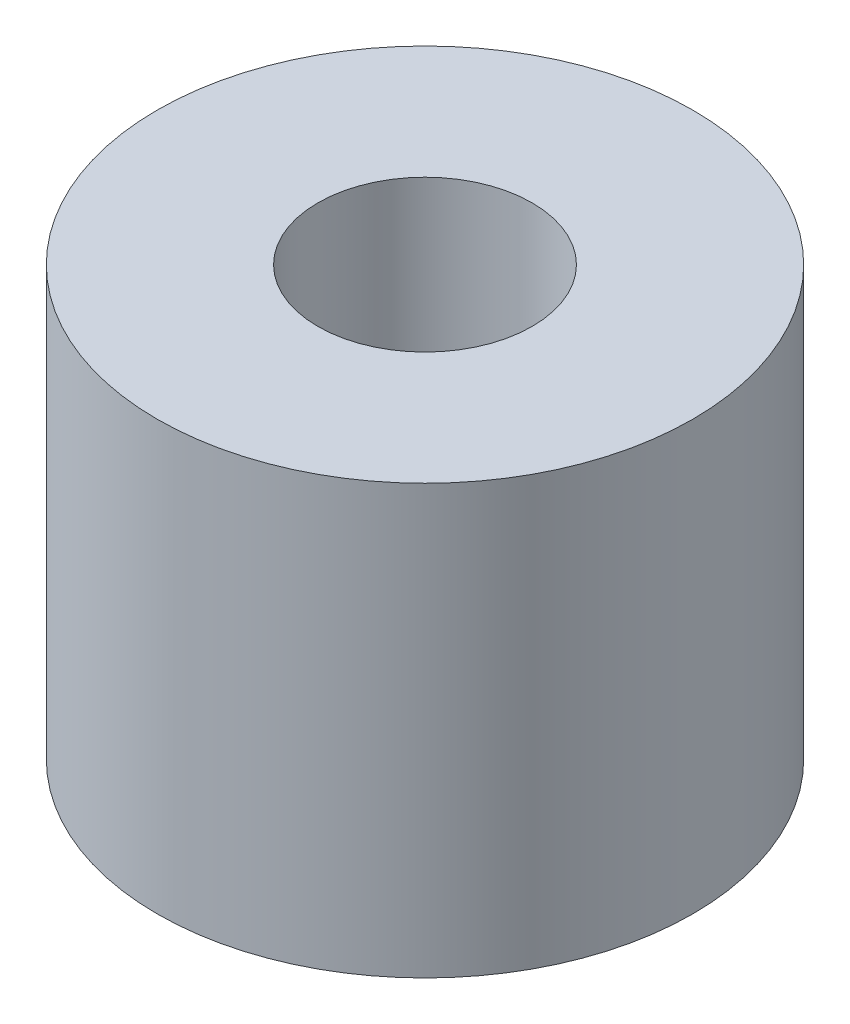
ISO-10303-21;
HEADER;
FILE_DESCRIPTION(('STEP AP214'),'2;1');
FILE_NAME('part.step','',(''),(''),'','','');
FILE_SCHEMA(('AUTOMOTIVE_DESIGN { 1 0 10303 214 1 1 1 1 }'));
ENDSEC;
DATA;
#1=APPLICATION_CONTEXT('core data for automotive mechanical design processes');
#2=APPLICATION_PROTOCOL_DEFINITION('international standard','automotive_design',2000,#1);
#3=PRODUCT_CONTEXT('',#1,'mechanical');
#4=PRODUCT('Part','Part','',(#3));
#5=PRODUCT_RELATED_PRODUCT_CATEGORY('part','',(#4));
#6=PRODUCT_DEFINITION_FORMATION('','',#4);
#7=PRODUCT_DEFINITION_CONTEXT('part definition',#1,'design');
#8=PRODUCT_DEFINITION('design','',#6,#7);
#9=PRODUCT_DEFINITION_SHAPE('','',#8);
#10=(LENGTH_UNIT() NAMED_UNIT(*) SI_UNIT(.MILLI.,.METRE.));
#11=(NAMED_UNIT(*) PLANE_ANGLE_UNIT() SI_UNIT($,.RADIAN.));
#12=(NAMED_UNIT(*) SI_UNIT($,.STERADIAN.) SOLID_ANGLE_UNIT());
#13=UNCERTAINTY_MEASURE_WITH_UNIT(LENGTH_MEASURE(1.E-05),#10,'distance_accuracy_value','');
#14=(GEOMETRIC_REPRESENTATION_CONTEXT(3) GLOBAL_UNCERTAINTY_ASSIGNED_CONTEXT((#13)) GLOBAL_UNIT_ASSIGNED_CONTEXT((#10,
#11,#12)) REPRESENTATION_CONTEXT('',''));
#15=CARTESIAN_POINT('',(0.,0.,0.));
#16=DIRECTION('',(0.,0.,1.));
#17=DIRECTION('',(1.,0.,0.));
#18=AXIS2_PLACEMENT_3D('',#15,#16,#17);
#19=CARTESIAN_POINT('',(0.,4.,0.));
#20=DIRECTION('',(0.,-1.,0.));
#21=DIRECTION('',(0.,0.,-1.));
#22=AXIS2_PLACEMENT_3D('',#19,#20,#21);
#23=CYLINDRICAL_SURFACE('',#22,2.5);
#24=CARTESIAN_POINT('',(0.,4.,0.));
#25=DIRECTION('',(0.,1.,0.));
#26=DIRECTION('',(0.,0.,1.));
#27=AXIS2_PLACEMENT_3D('',#24,#25,#26);
#28=CIRCLE('',#27,2.5);
#29=CARTESIAN_POINT('',(0.,4.,2.5));
#30=VERTEX_POINT('',#29);
#31=EDGE_CURVE('E10',#30,#30,#28,.T.);
#32=ORIENTED_EDGE('',*,*,#31,.F.);
#33=EDGE_LOOP('',(#32));
#34=FACE_BOUND('',#33,.T.);
#35=CARTESIAN_POINT('',(0.,0.,0.));
#36=DIRECTION('',(0.,1.,0.));
#37=DIRECTION('',(0.,0.,1.));
#38=AXIS2_PLACEMENT_3D('',#35,#36,#37);
#39=CIRCLE('',#38,2.5);
#40=CARTESIAN_POINT('',(0.,0.,2.5));
#41=VERTEX_POINT('',#40);
#42=EDGE_CURVE('E35',#41,#41,#39,.T.);
#43=ORIENTED_EDGE('',*,*,#42,.T.);
#44=EDGE_LOOP('',(#43));
#45=FACE_BOUND('',#44,.T.);
#46=ADVANCED_FACE('F32',(#34,#45),#23,.T.);
#47=CARTESIAN_POINT('',(0.,4.,0.));
#48=DIRECTION('',(0.,1.,0.));
#49=DIRECTION('',(0.,0.,1.));
#50=AXIS2_PLACEMENT_3D('',#47,#48,#49);
#51=PLANE('',#50);
#52=CARTESIAN_POINT('',(0.,4.,0.));
#53=DIRECTION('',(0.,1.,0.));
#54=DIRECTION('',(0.,0.,1.));
#55=AXIS2_PLACEMENT_3D('',#52,#53,#54);
#56=CIRCLE('',#55,1.);
#57=CARTESIAN_POINT('',(0.,4.,1.));
#58=VERTEX_POINT('',#57);
#59=EDGE_CURVE('E44',#58,#58,#56,.T.);
#60=ORIENTED_EDGE('',*,*,#59,.F.);
#61=EDGE_LOOP('',(#60));
#62=FACE_BOUND('',#61,.T.);
#63=ORIENTED_EDGE('',*,*,#31,.T.);
#64=EDGE_LOOP('',(#63));
#65=FACE_BOUND('',#64,.T.);
#66=ADVANCED_FACE('F59',(#62,#65),#51,.T.);
#67=CARTESIAN_POINT('',(0.,0.,0.));
#68=DIRECTION('',(0.,1.,0.));
#69=DIRECTION('',(0.,0.,1.));
#70=AXIS2_PLACEMENT_3D('',#67,#68,#69);
#71=PLANE('',#70);
#72=CARTESIAN_POINT('',(0.,0.,0.));
#73=DIRECTION('',(0.,1.,0.));
#74=DIRECTION('',(0.,0.,1.));
#75=AXIS2_PLACEMENT_3D('',#72,#73,#74);
#76=CIRCLE('',#75,1.);
#77=CARTESIAN_POINT('',(0.,0.,1.));
#78=VERTEX_POINT('',#77);
#79=EDGE_CURVE('E42',#78,#78,#76,.T.);
#80=ORIENTED_EDGE('',*,*,#79,.T.);
#81=EDGE_LOOP('',(#80));
#82=FACE_BOUND('',#81,.T.);
#83=ORIENTED_EDGE('',*,*,#42,.F.);
#84=EDGE_LOOP('',(#83));
#85=FACE_BOUND('',#84,.T.);
#86=ADVANCED_FACE('F50',(#82,#85),#71,.F.);
#87=CARTESIAN_POINT('',(0.,0.,0.));
#88=DIRECTION('',(0.,1.,0.));
#89=DIRECTION('',(0.,0.,1.));
#90=AXIS2_PLACEMENT_3D('',#87,#88,#89);
#91=CYLINDRICAL_SURFACE('',#90,1.);
#92=ORIENTED_EDGE('',*,*,#79,.F.);
#93=EDGE_LOOP('',(#92));
#94=FACE_BOUND('',#93,.T.);
#95=ORIENTED_EDGE('',*,*,#59,.T.);
#96=EDGE_LOOP('',(#95));
#97=FACE_BOUND('',#96,.T.);
#98=ADVANCED_FACE('F53',(#94,#97),#91,.F.);
#99=CLOSED_SHELL('',(#46,#66,#86,#98));
#100=MANIFOLD_SOLID_BREP('B2',#99);
#101=ADVANCED_BREP_SHAPE_REPRESENTATION('',(#18,#100),#14);
#102=SHAPE_DEFINITION_REPRESENTATION(#9,#101);
ENDSEC;
END-ISO-10303-21;
